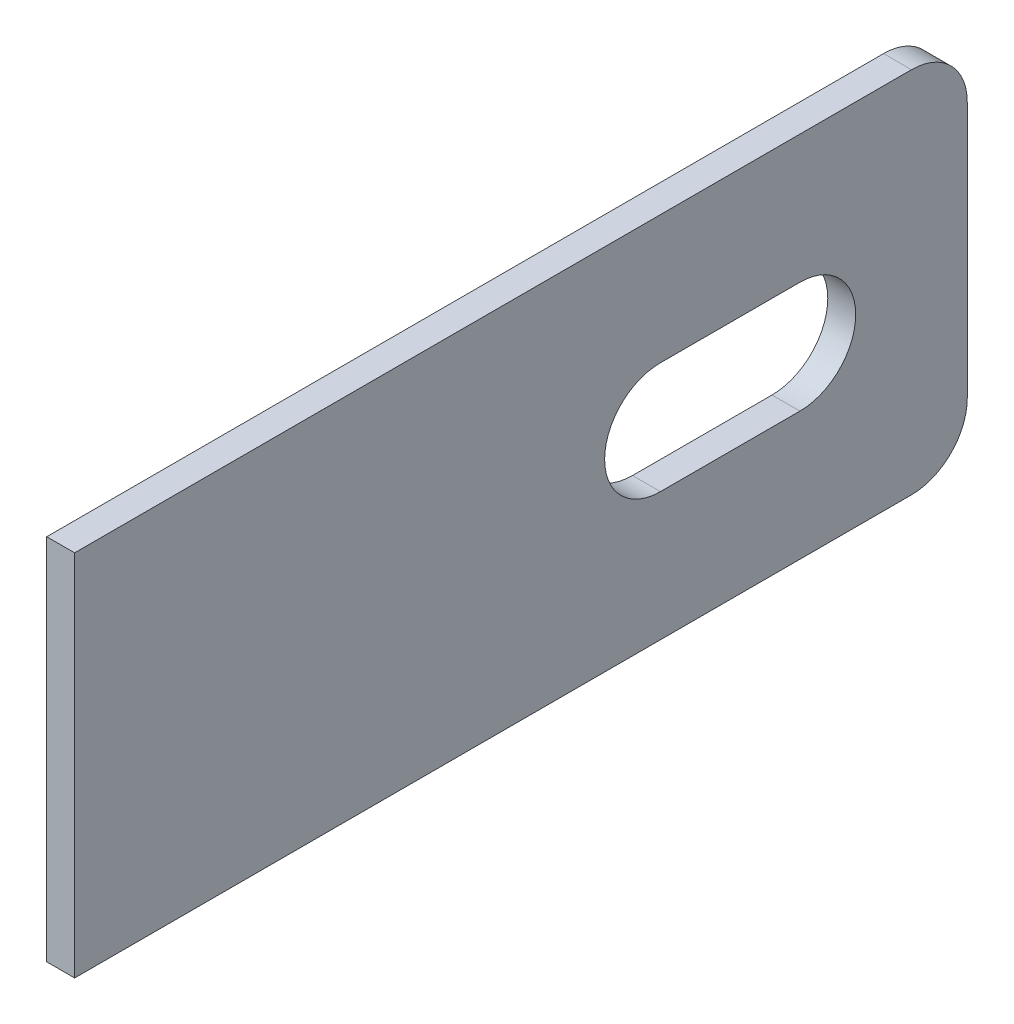
ISO-10303-21;
HEADER;
FILE_DESCRIPTION(('STEP AP214'),'2;1');
FILE_NAME('part.step','',(''),(''),'','','');
FILE_SCHEMA(('AUTOMOTIVE_DESIGN { 1 0 10303 214 1 1 1 1 }'));
ENDSEC;
DATA;
#1=APPLICATION_CONTEXT('core data for automotive mechanical design processes');
#2=APPLICATION_PROTOCOL_DEFINITION('international standard','automotive_design',2000,#1);
#3=PRODUCT_CONTEXT('',#1,'mechanical');
#4=PRODUCT('Part','Part','',(#3));
#5=PRODUCT_RELATED_PRODUCT_CATEGORY('part','',(#4));
#6=PRODUCT_DEFINITION_FORMATION('','',#4);
#7=PRODUCT_DEFINITION_CONTEXT('part definition',#1,'design');
#8=PRODUCT_DEFINITION('design','',#6,#7);
#9=PRODUCT_DEFINITION_SHAPE('','',#8);
#10=(LENGTH_UNIT() NAMED_UNIT(*) SI_UNIT(.MILLI.,.METRE.));
#11=(NAMED_UNIT(*) PLANE_ANGLE_UNIT() SI_UNIT($,.RADIAN.));
#12=(NAMED_UNIT(*) SI_UNIT($,.STERADIAN.) SOLID_ANGLE_UNIT());
#13=UNCERTAINTY_MEASURE_WITH_UNIT(LENGTH_MEASURE(1.E-05),#10,'distance_accuracy_value','');
#14=(GEOMETRIC_REPRESENTATION_CONTEXT(3) GLOBAL_UNCERTAINTY_ASSIGNED_CONTEXT((#13)) GLOBAL_UNIT_ASSIGNED_CONTEXT((#10,
#11,#12)) REPRESENTATION_CONTEXT('',''));
#15=CARTESIAN_POINT('',(0.,0.,0.));
#16=DIRECTION('',(0.,0.,1.));
#17=DIRECTION('',(1.,0.,0.));
#18=AXIS2_PLACEMENT_3D('',#15,#16,#17);
#19=CARTESIAN_POINT('',(5.,66.,-160.));
#20=DIRECTION('',(0.,0.,1.));
#21=DIRECTION('',(0.,-1.,0.));
#22=AXIS2_PLACEMENT_3D('',#19,#20,#21);
#23=PLANE('',#22);
#24=DIRECTION('',(0.,1.,0.));
#25=VECTOR('',#24,1.);
#26=CARTESIAN_POINT('',(5.,66.,-160.));
#27=LINE('',#26,#25);
#28=CARTESIAN_POINT('',(5.,-46.,-160.));
#29=VERTEX_POINT('',#28);
#30=CARTESIAN_POINT('',(5.,46.,-160.));
#31=VERTEX_POINT('',#30);
#32=EDGE_CURVE('E149',#29,#31,#27,.T.);
#33=ORIENTED_EDGE('',*,*,#32,.F.);
#34=DIRECTION('',(-1.,0.,0.));
#35=VECTOR('',#34,1.);
#36=CARTESIAN_POINT('',(5.,-46.,-160.));
#37=LINE('',#36,#35);
#38=CARTESIAN_POINT('',(-5.,-46.,-160.));
#39=VERTEX_POINT('',#38);
#40=EDGE_CURVE('E178',#29,#39,#37,.T.);
#41=ORIENTED_EDGE('',*,*,#40,.T.);
#42=DIRECTION('',(0.,1.,0.));
#43=VECTOR('',#42,1.);
#44=CARTESIAN_POINT('',(-5.,66.,-160.));
#45=LINE('',#44,#43);
#46=CARTESIAN_POINT('',(-5.,46.,-160.));
#47=VERTEX_POINT('',#46);
#48=EDGE_CURVE('E117',#39,#47,#45,.T.);
#49=ORIENTED_EDGE('',*,*,#48,.T.);
#50=DIRECTION('',(-1.,0.,0.));
#51=VECTOR('',#50,1.);
#52=CARTESIAN_POINT('',(5.,46.,-160.));
#53=LINE('',#52,#51);
#54=EDGE_CURVE('E176',#47,#31,#53,.F.);
#55=ORIENTED_EDGE('',*,*,#54,.T.);
#56=EDGE_LOOP('',(#33,#41,#49,#55));
#57=FACE_BOUND('',#56,.T.);
#58=ADVANCED_FACE('F17',(#57),#23,.F.);
#59=CARTESIAN_POINT('',(5.,66.,160.));
#60=DIRECTION('',(0.,-1.,0.));
#61=DIRECTION('',(0.,0.,-1.));
#62=AXIS2_PLACEMENT_3D('',#59,#60,#61);
#63=PLANE('',#62);
#64=DIRECTION('',(0.,0.,1.));
#65=VECTOR('',#64,1.);
#66=CARTESIAN_POINT('',(5.,66.,160.));
#67=LINE('',#66,#65);
#68=CARTESIAN_POINT('',(5.,66.,-140.));
#69=VERTEX_POINT('',#68);
#70=CARTESIAN_POINT('',(5.,66.,160.));
#71=VERTEX_POINT('',#70);
#72=EDGE_CURVE('E152',#69,#71,#67,.T.);
#73=ORIENTED_EDGE('',*,*,#72,.F.);
#74=DIRECTION('',(-1.,0.,0.));
#75=VECTOR('',#74,1.);
#76=CARTESIAN_POINT('',(5.,66.,-140.));
#77=LINE('',#76,#75);
#78=CARTESIAN_POINT('',(-5.,66.,-140.));
#79=VERTEX_POINT('',#78);
#80=EDGE_CURVE('E11',#69,#79,#77,.T.);
#81=ORIENTED_EDGE('',*,*,#80,.T.);
#82=DIRECTION('',(0.,0.,1.));
#83=VECTOR('',#82,1.);
#84=CARTESIAN_POINT('',(-5.,66.,160.));
#85=LINE('',#84,#83);
#86=CARTESIAN_POINT('',(-5.,66.,160.));
#87=VERTEX_POINT('',#86);
#88=EDGE_CURVE('E163',#79,#87,#85,.T.);
#89=ORIENTED_EDGE('',*,*,#88,.T.);
#90=DIRECTION('',(-1.,0.,0.));
#91=VECTOR('',#90,1.);
#92=CARTESIAN_POINT('',(5.,66.,160.));
#93=LINE('',#92,#91);
#94=EDGE_CURVE('E173',#71,#87,#93,.T.);
#95=ORIENTED_EDGE('',*,*,#94,.F.);
#96=EDGE_LOOP('',(#73,#81,#89,#95));
#97=FACE_BOUND('',#96,.T.);
#98=ADVANCED_FACE('F211',(#97),#63,.F.);
#99=CARTESIAN_POINT('',(5.,66.,160.));
#100=DIRECTION('',(0.,0.,-1.));
#101=DIRECTION('',(-1.,0.,0.));
#102=AXIS2_PLACEMENT_3D('',#99,#100,#101);
#103=PLANE('',#102);
#104=DIRECTION('',(0.,-1.,0.));
#105=VECTOR('',#104,1.);
#106=CARTESIAN_POINT('',(-5.,66.,160.));
#107=LINE('',#106,#105);
#108=CARTESIAN_POINT('',(-5.,-66.,160.));
#109=VERTEX_POINT('',#108);
#110=EDGE_CURVE('E166',#87,#109,#107,.T.);
#111=ORIENTED_EDGE('',*,*,#110,.T.);
#112=DIRECTION('',(-1.,0.,0.));
#113=VECTOR('',#112,1.);
#114=CARTESIAN_POINT('',(5.,-66.,160.));
#115=LINE('',#114,#113);
#116=CARTESIAN_POINT('',(5.,-66.,160.));
#117=VERTEX_POINT('',#116);
#118=EDGE_CURVE('E159',#117,#109,#115,.T.);
#119=ORIENTED_EDGE('',*,*,#118,.F.);
#120=DIRECTION('',(0.,-1.,0.));
#121=VECTOR('',#120,1.);
#122=CARTESIAN_POINT('',(5.,66.,160.));
#123=LINE('',#122,#121);
#124=EDGE_CURVE('E155',#71,#117,#123,.T.);
#125=ORIENTED_EDGE('',*,*,#124,.F.);
#126=ORIENTED_EDGE('',*,*,#94,.T.);
#127=EDGE_LOOP('',(#111,#119,#125,#126));
#128=FACE_BOUND('',#127,.T.);
#129=ADVANCED_FACE('F207',(#128),#103,.F.);
#130=CARTESIAN_POINT('',(5.,-66.,160.));
#131=DIRECTION('',(0.,1.,0.));
#132=DIRECTION('',(0.,0.,1.));
#133=AXIS2_PLACEMENT_3D('',#130,#131,#132);
#134=PLANE('',#133);
#135=DIRECTION('',(0.,0.,-1.));
#136=VECTOR('',#135,1.);
#137=CARTESIAN_POINT('',(-5.,-66.,160.));
#138=LINE('',#137,#136);
#139=CARTESIAN_POINT('',(-5.,-66.,-140.));
#140=VERTEX_POINT('',#139);
#141=EDGE_CURVE('E153',#109,#140,#138,.T.);
#142=ORIENTED_EDGE('',*,*,#141,.T.);
#143=DIRECTION('',(-1.,0.,0.));
#144=VECTOR('',#143,1.);
#145=CARTESIAN_POINT('',(5.,-66.,-140.));
#146=LINE('',#145,#144);
#147=CARTESIAN_POINT('',(5.,-66.,-140.));
#148=VERTEX_POINT('',#147);
#149=EDGE_CURVE('E40',#140,#148,#146,.F.);
#150=ORIENTED_EDGE('',*,*,#149,.T.);
#151=DIRECTION('',(0.,0.,-1.));
#152=VECTOR('',#151,1.);
#153=CARTESIAN_POINT('',(5.,-66.,160.));
#154=LINE('',#153,#152);
#155=EDGE_CURVE('E157',#117,#148,#154,.T.);
#156=ORIENTED_EDGE('',*,*,#155,.F.);
#157=ORIENTED_EDGE('',*,*,#118,.T.);
#158=EDGE_LOOP('',(#142,#150,#156,#157));
#159=FACE_BOUND('',#158,.T.);
#160=ADVANCED_FACE('F203',(#159),#134,.F.);
#161=CARTESIAN_POINT('',(5.,0.,0.));
#162=DIRECTION('',(1.,0.,0.));
#163=DIRECTION('',(0.,0.,-1.));
#164=AXIS2_PLACEMENT_3D('',#161,#162,#163);
#165=PLANE('',#164);
#166=CARTESIAN_POINT('',(5.,0.,-50.));
#167=DIRECTION('',(1.,0.,0.));
#168=DIRECTION('',(0.,0.,-1.));
#169=AXIS2_PLACEMENT_3D('',#166,#167,#168);
#170=CIRCLE('',#169,20.);
#171=CARTESIAN_POINT('',(5.,20.,-50.));
#172=VERTEX_POINT('',#171);
#173=CARTESIAN_POINT('',(5.,-20.,-50.));
#174=VERTEX_POINT('',#173);
#175=EDGE_CURVE('E104',#172,#174,#170,.T.);
#176=ORIENTED_EDGE('',*,*,#175,.F.);
#177=DIRECTION('',(0.,0.,1.));
#178=VECTOR('',#177,1.);
#179=CARTESIAN_POINT('',(5.,20.,-50.));
#180=LINE('',#179,#178);
#181=CARTESIAN_POINT('',(5.,20.,-100.));
#182=VERTEX_POINT('',#181);
#183=EDGE_CURVE('E109',#182,#172,#180,.T.);
#184=ORIENTED_EDGE('',*,*,#183,.F.);
#185=CARTESIAN_POINT('',(5.,0.,-100.));
#186=DIRECTION('',(1.,0.,0.));
#187=DIRECTION('',(0.,0.,-1.));
#188=AXIS2_PLACEMENT_3D('',#185,#186,#187);
#189=CIRCLE('',#188,20.);
#190=CARTESIAN_POINT('',(5.,-20.,-100.));
#191=VERTEX_POINT('',#190);
#192=EDGE_CURVE('E138',#191,#182,#189,.T.);
#193=ORIENTED_EDGE('',*,*,#192,.F.);
#194=DIRECTION('',(0.,0.,-1.));
#195=VECTOR('',#194,1.);
#196=CARTESIAN_POINT('',(5.,-20.,-50.));
#197=LINE('',#196,#195);
#198=EDGE_CURVE('E131',#174,#191,#197,.T.);
#199=ORIENTED_EDGE('',*,*,#198,.F.);
#200=EDGE_LOOP('',(#176,#184,#193,#199));
#201=FACE_BOUND('',#200,.T.);
#202=ORIENTED_EDGE('',*,*,#155,.T.);
#203=CARTESIAN_POINT('',(5.,-46.,-140.));
#204=DIRECTION('',(1.,0.,0.));
#205=DIRECTION('',(0.,0.,-1.));
#206=AXIS2_PLACEMENT_3D('',#203,#204,#205);
#207=CIRCLE('',#206,20.);
#208=EDGE_CURVE('E25',#148,#29,#207,.T.);
#209=ORIENTED_EDGE('',*,*,#208,.T.);
#210=ORIENTED_EDGE('',*,*,#32,.T.);
#211=CARTESIAN_POINT('',(5.,46.,-140.));
#212=DIRECTION('',(1.,0.,0.));
#213=DIRECTION('',(0.,0.,-1.));
#214=AXIS2_PLACEMENT_3D('',#211,#212,#213);
#215=CIRCLE('',#214,20.);
#216=EDGE_CURVE('E32',#31,#69,#215,.T.);
#217=ORIENTED_EDGE('',*,*,#216,.T.);
#218=ORIENTED_EDGE('',*,*,#72,.T.);
#219=ORIENTED_EDGE('',*,*,#124,.T.);
#220=EDGE_LOOP('',(#202,#209,#210,#217,#218,#219));
#221=FACE_BOUND('',#220,.T.);
#222=ADVANCED_FACE('F194',(#201,#221),#165,.T.);
#223=CARTESIAN_POINT('',(-5.,0.,0.));
#224=DIRECTION('',(1.,0.,0.));
#225=DIRECTION('',(0.,0.,-1.));
#226=AXIS2_PLACEMENT_3D('',#223,#224,#225);
#227=PLANE('',#226);
#228=DIRECTION('',(0.,0.,-1.));
#229=VECTOR('',#228,1.);
#230=CARTESIAN_POINT('',(-5.,20.,-50.));
#231=LINE('',#230,#229);
#232=CARTESIAN_POINT('',(-5.,20.,-50.));
#233=VERTEX_POINT('',#232);
#234=CARTESIAN_POINT('',(-5.,20.,-100.));
#235=VERTEX_POINT('',#234);
#236=EDGE_CURVE('E123',#233,#235,#231,.T.);
#237=ORIENTED_EDGE('',*,*,#236,.F.);
#238=CARTESIAN_POINT('',(-5.,0.,-50.));
#239=DIRECTION('',(1.,0.,0.));
#240=DIRECTION('',(0.,0.,-1.));
#241=AXIS2_PLACEMENT_3D('',#238,#239,#240);
#242=CIRCLE('',#241,20.);
#243=CARTESIAN_POINT('',(-5.,-20.,-50.));
#244=VERTEX_POINT('',#243);
#245=EDGE_CURVE('E101',#244,#233,#242,.F.);
#246=ORIENTED_EDGE('',*,*,#245,.F.);
#247=DIRECTION('',(0.,0.,1.));
#248=VECTOR('',#247,1.);
#249=CARTESIAN_POINT('',(-5.,-20.,-50.));
#250=LINE('',#249,#248);
#251=CARTESIAN_POINT('',(-5.,-20.,-100.));
#252=VERTEX_POINT('',#251);
#253=EDGE_CURVE('E113',#252,#244,#250,.T.);
#254=ORIENTED_EDGE('',*,*,#253,.F.);
#255=CARTESIAN_POINT('',(-5.,0.,-100.));
#256=DIRECTION('',(1.,0.,0.));
#257=DIRECTION('',(0.,0.,-1.));
#258=AXIS2_PLACEMENT_3D('',#255,#256,#257);
#259=CIRCLE('',#258,20.);
#260=EDGE_CURVE('E133',#235,#252,#259,.F.);
#261=ORIENTED_EDGE('',*,*,#260,.F.);
#262=EDGE_LOOP('',(#237,#246,#254,#261));
#263=FACE_BOUND('',#262,.T.);
#264=ORIENTED_EDGE('',*,*,#48,.F.);
#265=CARTESIAN_POINT('',(-5.,-46.,-140.));
#266=DIRECTION('',(1.,0.,0.));
#267=DIRECTION('',(0.,0.,-1.));
#268=AXIS2_PLACEMENT_3D('',#265,#266,#267);
#269=CIRCLE('',#268,20.);
#270=EDGE_CURVE('E185',#39,#140,#269,.F.);
#271=ORIENTED_EDGE('',*,*,#270,.T.);
#272=ORIENTED_EDGE('',*,*,#141,.F.);
#273=ORIENTED_EDGE('',*,*,#110,.F.);
#274=ORIENTED_EDGE('',*,*,#88,.F.);
#275=CARTESIAN_POINT('',(-5.,46.,-140.));
#276=DIRECTION('',(1.,0.,0.));
#277=DIRECTION('',(0.,0.,-1.));
#278=AXIS2_PLACEMENT_3D('',#275,#276,#277);
#279=CIRCLE('',#278,20.);
#280=EDGE_CURVE('E182',#79,#47,#279,.F.);
#281=ORIENTED_EDGE('',*,*,#280,.T.);
#282=EDGE_LOOP('',(#264,#271,#272,#273,#274,#281));
#283=FACE_BOUND('',#282,.T.);
#284=ADVANCED_FACE('F120',(#263,#283),#227,.F.);
#285=CARTESIAN_POINT('',(-5.001,0.,-50.));
#286=DIRECTION('',(1.,0.,0.));
#287=DIRECTION('',(0.,0.,-1.));
#288=AXIS2_PLACEMENT_3D('',#285,#286,#287);
#289=CYLINDRICAL_SURFACE('',#288,20.);
#290=ORIENTED_EDGE('',*,*,#245,.T.);
#291=DIRECTION('',(1.,0.,0.));
#292=VECTOR('',#291,1.);
#293=CARTESIAN_POINT('',(-5.001,20.,-50.));
#294=LINE('',#293,#292);
#295=EDGE_CURVE('E118',#233,#172,#294,.T.);
#296=ORIENTED_EDGE('',*,*,#295,.T.);
#297=ORIENTED_EDGE('',*,*,#175,.T.);
#298=DIRECTION('',(1.,0.,0.));
#299=VECTOR('',#298,1.);
#300=CARTESIAN_POINT('',(-5.001,-20.,-50.));
#301=LINE('',#300,#299);
#302=EDGE_CURVE('E97',#244,#174,#301,.T.);
#303=ORIENTED_EDGE('',*,*,#302,.F.);
#304=EDGE_LOOP('',(#290,#296,#297,#303));
#305=FACE_BOUND('',#304,.T.);
#306=ADVANCED_FACE('F99',(#305),#289,.F.);
#307=CARTESIAN_POINT('',(-5.001,20.,-50.));
#308=DIRECTION('',(0.,1.,0.));
#309=DIRECTION('',(0.,0.,1.));
#310=AXIS2_PLACEMENT_3D('',#307,#308,#309);
#311=PLANE('',#310);
#312=ORIENTED_EDGE('',*,*,#236,.T.);
#313=DIRECTION('',(1.,0.,0.));
#314=VECTOR('',#313,1.);
#315=CARTESIAN_POINT('',(-5.001,20.,-100.));
#316=LINE('',#315,#314);
#317=EDGE_CURVE('E145',#235,#182,#316,.T.);
#318=ORIENTED_EDGE('',*,*,#317,.T.);
#319=ORIENTED_EDGE('',*,*,#183,.T.);
#320=ORIENTED_EDGE('',*,*,#295,.F.);
#321=EDGE_LOOP('',(#312,#318,#319,#320));
#322=FACE_BOUND('',#321,.T.);
#323=ADVANCED_FACE('F239',(#322),#311,.F.);
#324=CARTESIAN_POINT('',(-5.001,0.,-100.));
#325=DIRECTION('',(1.,0.,0.));
#326=DIRECTION('',(0.,0.,-1.));
#327=AXIS2_PLACEMENT_3D('',#324,#325,#326);
#328=CYLINDRICAL_SURFACE('',#327,20.);
#329=ORIENTED_EDGE('',*,*,#260,.T.);
#330=DIRECTION('',(1.,0.,0.));
#331=VECTOR('',#330,1.);
#332=CARTESIAN_POINT('',(-5.001,-20.,-100.));
#333=LINE('',#332,#331);
#334=EDGE_CURVE('E108',#252,#191,#333,.T.);
#335=ORIENTED_EDGE('',*,*,#334,.T.);
#336=ORIENTED_EDGE('',*,*,#192,.T.);
#337=ORIENTED_EDGE('',*,*,#317,.F.);
#338=EDGE_LOOP('',(#329,#335,#336,#337));
#339=FACE_BOUND('',#338,.T.);
#340=ADVANCED_FACE('F242',(#339),#328,.F.);
#341=CARTESIAN_POINT('',(-5.001,-20.,-50.));
#342=DIRECTION('',(0.,-1.,0.));
#343=DIRECTION('',(0.,0.,-1.));
#344=AXIS2_PLACEMENT_3D('',#341,#342,#343);
#345=PLANE('',#344);
#346=ORIENTED_EDGE('',*,*,#253,.T.);
#347=ORIENTED_EDGE('',*,*,#302,.T.);
#348=ORIENTED_EDGE('',*,*,#198,.T.);
#349=ORIENTED_EDGE('',*,*,#334,.F.);
#350=EDGE_LOOP('',(#346,#347,#348,#349));
#351=FACE_BOUND('',#350,.T.);
#352=ADVANCED_FACE('F114',(#351),#345,.F.);
#353=CARTESIAN_POINT('',(5.,-46.,-140.));
#354=DIRECTION('',(-1.,0.,0.));
#355=DIRECTION('',(0.,0.,1.));
#356=AXIS2_PLACEMENT_3D('',#353,#354,#355);
#357=CYLINDRICAL_SURFACE('',#356,20.);
#358=ORIENTED_EDGE('',*,*,#208,.F.);
#359=ORIENTED_EDGE('',*,*,#149,.F.);
#360=ORIENTED_EDGE('',*,*,#270,.F.);
#361=ORIENTED_EDGE('',*,*,#40,.F.);
#362=EDGE_LOOP('',(#358,#359,#360,#361));
#363=FACE_BOUND('',#362,.T.);
#364=ADVANCED_FACE('F200',(#363),#357,.T.);
#365=CARTESIAN_POINT('',(5.,46.,-140.));
#366=DIRECTION('',(-1.,0.,0.));
#367=DIRECTION('',(0.,0.,1.));
#368=AXIS2_PLACEMENT_3D('',#365,#366,#367);
#369=CYLINDRICAL_SURFACE('',#368,20.);
#370=ORIENTED_EDGE('',*,*,#216,.F.);
#371=ORIENTED_EDGE('',*,*,#54,.F.);
#372=ORIENTED_EDGE('',*,*,#280,.F.);
#373=ORIENTED_EDGE('',*,*,#80,.F.);
#374=EDGE_LOOP('',(#370,#371,#372,#373));
#375=FACE_BOUND('',#374,.T.);
#376=ADVANCED_FACE('F19',(#375),#369,.T.);
#377=CLOSED_SHELL('',(#58,#98,#129,#160,#222,#284,#306,#323,#340,#352,#364,#376));
#378=MANIFOLD_SOLID_BREP('B1',#377);
#379=ADVANCED_BREP_SHAPE_REPRESENTATION('',(#18,#378),#14);
#380=SHAPE_DEFINITION_REPRESENTATION(#9,#379);
ENDSEC;
END-ISO-10303-21;
